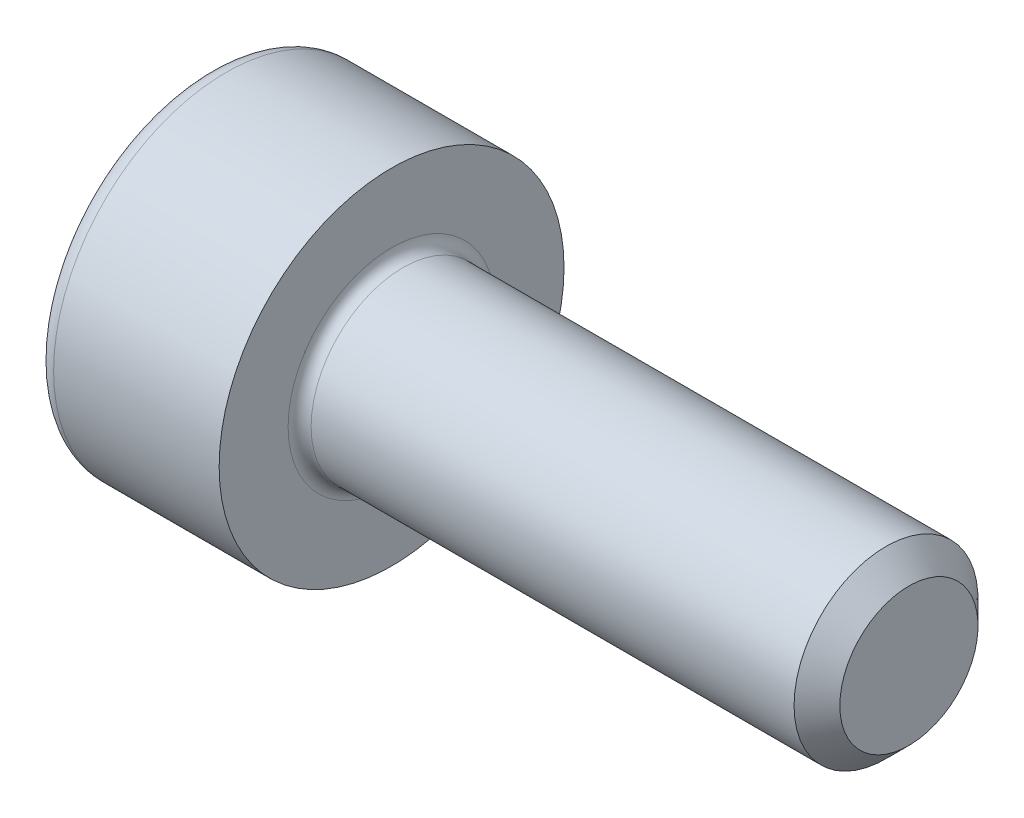
ISO-10303-21;
HEADER;
FILE_DESCRIPTION(('STEP AP214'),'2;1');
FILE_NAME('part.step','',(''),(''),'','','');
FILE_SCHEMA(('AUTOMOTIVE_DESIGN { 1 0 10303 214 1 1 1 1 }'));
ENDSEC;
DATA;
#1=APPLICATION_CONTEXT('core data for automotive mechanical design processes');
#2=APPLICATION_PROTOCOL_DEFINITION('international standard','automotive_design',2000,#1);
#3=PRODUCT_CONTEXT('',#1,'mechanical');
#4=PRODUCT('Part','Part','',(#3));
#5=PRODUCT_RELATED_PRODUCT_CATEGORY('part','',(#4));
#6=PRODUCT_DEFINITION_FORMATION('','',#4);
#7=PRODUCT_DEFINITION_CONTEXT('part definition',#1,'design');
#8=PRODUCT_DEFINITION('design','',#6,#7);
#9=PRODUCT_DEFINITION_SHAPE('','',#8);
#10=(LENGTH_UNIT() NAMED_UNIT(*) SI_UNIT(.MILLI.,.METRE.));
#11=(NAMED_UNIT(*) PLANE_ANGLE_UNIT() SI_UNIT($,.RADIAN.));
#12=(NAMED_UNIT(*) SI_UNIT($,.STERADIAN.) SOLID_ANGLE_UNIT());
#13=UNCERTAINTY_MEASURE_WITH_UNIT(LENGTH_MEASURE(1.E-05),#10,'distance_accuracy_value','');
#14=(GEOMETRIC_REPRESENTATION_CONTEXT(3) GLOBAL_UNCERTAINTY_ASSIGNED_CONTEXT((#13)) GLOBAL_UNIT_ASSIGNED_CONTEXT((#10,
#11,#12)) REPRESENTATION_CONTEXT('',''));
#15=CARTESIAN_POINT('',(0.,0.,0.));
#16=DIRECTION('',(0.,0.,1.));
#17=DIRECTION('',(1.,0.,0.));
#18=AXIS2_PLACEMENT_3D('',#15,#16,#17);
#19=CARTESIAN_POINT('',(0.,0.,0.));
#20=DIRECTION('',(-1.,0.,0.));
#21=DIRECTION('',(0.,0.,1.));
#22=AXIS2_PLACEMENT_3D('',#19,#20,#21);
#23=PLANE('',#22);
#24=DIRECTION('',(0.,-0.499999999999998,0.866025403784439));
#25=VECTOR('',#24,1.);
#26=CARTESIAN_POINT('',(0.,0.877572409168226,0.));
#27=LINE('',#26,#25);
#28=CARTESIAN_POINT('',(0.,0.877572409168226,0.));
#29=VERTEX_POINT('',#28);
#30=CARTESIAN_POINT('',(0.,0.438786204584112,0.759999999999998));
#31=VERTEX_POINT('',#30);
#32=EDGE_CURVE('E260',#29,#31,#27,.T.);
#33=ORIENTED_EDGE('',*,*,#32,.T.);
#34=DIRECTION('',(0.,1.,0.));
#35=VECTOR('',#34,1.);
#36=CARTESIAN_POINT('',(0.,-0.43878620458412,0.76));
#37=LINE('',#36,#35);
#38=CARTESIAN_POINT('',(0.,-0.43878620458412,0.76));
#39=VERTEX_POINT('',#38);
#40=EDGE_CURVE('E132',#39,#31,#37,.T.);
#41=ORIENTED_EDGE('',*,*,#40,.F.);
#42=DIRECTION('',(0.,-0.500000000000001,-0.866025403784438));
#43=VECTOR('',#42,1.);
#44=CARTESIAN_POINT('',(0.,-0.43878620458412,0.76));
#45=LINE('',#44,#43);
#46=CARTESIAN_POINT('',(0.,-0.877572409168237,0.));
#47=VERTEX_POINT('',#46);
#48=EDGE_CURVE('E263',#39,#47,#45,.T.);
#49=ORIENTED_EDGE('',*,*,#48,.T.);
#50=DIRECTION('',(0.,0.499999999999998,-0.866025403784439));
#51=VECTOR('',#50,1.);
#52=CARTESIAN_POINT('',(0.,-0.877572409168237,0.));
#53=LINE('',#52,#51);
#54=CARTESIAN_POINT('',(0.,-0.438786204584122,-0.760000000000002));
#55=VERTEX_POINT('',#54);
#56=EDGE_CURVE('E266',#47,#55,#53,.T.);
#57=ORIENTED_EDGE('',*,*,#56,.T.);
#58=DIRECTION('',(0.,-1.,0.));
#59=VECTOR('',#58,1.);
#60=CARTESIAN_POINT('',(0.,0.438786204584109,-0.760000000000003));
#61=LINE('',#60,#59);
#62=CARTESIAN_POINT('',(0.,0.438786204584109,-0.760000000000003));
#63=VERTEX_POINT('',#62);
#64=EDGE_CURVE('E269',#63,#55,#61,.T.);
#65=ORIENTED_EDGE('',*,*,#64,.F.);
#66=DIRECTION('',(0.,-0.500000000000001,-0.866025403784438));
#67=VECTOR('',#66,1.);
#68=CARTESIAN_POINT('',(0.,0.877572409168226,0.));
#69=LINE('',#68,#67);
#70=EDGE_CURVE('E127',#29,#63,#69,.T.);
#71=ORIENTED_EDGE('',*,*,#70,.F.);
#72=EDGE_LOOP('',(#33,#41,#49,#57,#65,#71));
#73=FACE_BOUND('',#72,.T.);
#74=CARTESIAN_POINT('',(0.,0.,0.));
#75=DIRECTION('',(-1.,0.,0.));
#76=DIRECTION('',(0.,0.,1.));
#77=AXIS2_PLACEMENT_3D('',#74,#75,#76);
#78=CIRCLE('',#77,1.34);
#79=CARTESIAN_POINT('',(0.,0.,1.34));
#80=VERTEX_POINT('',#79);
#81=EDGE_CURVE('E44',#80,#80,#78,.T.);
#82=ORIENTED_EDGE('',*,*,#81,.T.);
#83=EDGE_LOOP('',(#82));
#84=FACE_BOUND('',#83,.T.);
#85=ADVANCED_FACE('F36',(#73,#84),#23,.T.);
#86=CARTESIAN_POINT('',(-31.75,0.,0.));
#87=DIRECTION('',(-1.,0.,0.));
#88=DIRECTION('',(0.,0.,1.));
#89=AXIS2_PLACEMENT_3D('',#86,#87,#88);
#90=CYLINDRICAL_SURFACE('',#89,1.5);
#91=CARTESIAN_POINT('',(0.16,0.,0.));
#92=DIRECTION('',(-1.,0.,0.));
#93=DIRECTION('',(0.,0.,1.));
#94=AXIS2_PLACEMENT_3D('',#91,#92,#93);
#95=CIRCLE('',#94,1.5);
#96=CARTESIAN_POINT('',(0.16,0.,1.5));
#97=VERTEX_POINT('',#96);
#98=EDGE_CURVE('E11',#97,#97,#95,.F.);
#99=ORIENTED_EDGE('',*,*,#98,.T.);
#100=EDGE_LOOP('',(#99));
#101=FACE_BOUND('',#100,.T.);
#102=CARTESIAN_POINT('',(1.6,0.,0.));
#103=DIRECTION('',(-1.,0.,0.));
#104=DIRECTION('',(0.,0.,1.));
#105=AXIS2_PLACEMENT_3D('',#102,#103,#104);
#106=CIRCLE('',#105,1.5);
#107=CARTESIAN_POINT('',(1.6,0.,1.5));
#108=VERTEX_POINT('',#107);
#109=EDGE_CURVE('E150',#108,#108,#106,.T.);
#110=ORIENTED_EDGE('',*,*,#109,.T.);
#111=EDGE_LOOP('',(#110));
#112=FACE_BOUND('',#111,.T.);
#113=ADVANCED_FACE('F174',(#101,#112),#90,.T.);
#114=CARTESIAN_POINT('',(1.6,1.5,0.));
#115=DIRECTION('',(1.,0.,0.));
#116=DIRECTION('',(0.,0.,-1.));
#117=AXIS2_PLACEMENT_3D('',#114,#115,#116);
#118=PLANE('',#117);
#119=CARTESIAN_POINT('',(1.6,0.,0.));
#120=DIRECTION('',(1.,0.,0.));
#121=DIRECTION('',(0.,0.,-1.));
#122=AXIS2_PLACEMENT_3D('',#119,#120,#121);
#123=CIRCLE('',#122,0.899999999999994);
#124=CARTESIAN_POINT('',(1.6,0.,-0.899999999999994));
#125=VERTEX_POINT('',#124);
#126=EDGE_CURVE('E153',#125,#125,#123,.F.);
#127=ORIENTED_EDGE('',*,*,#126,.T.);
#128=EDGE_LOOP('',(#127));
#129=FACE_BOUND('',#128,.T.);
#130=ORIENTED_EDGE('',*,*,#109,.F.);
#131=EDGE_LOOP('',(#130));
#132=FACE_BOUND('',#131,.T.);
#133=ADVANCED_FACE('F180',(#129,#132),#118,.T.);
#134=CARTESIAN_POINT('',(-31.75,0.,0.));
#135=DIRECTION('',(-1.,0.,0.));
#136=DIRECTION('',(0.,0.,1.));
#137=AXIS2_PLACEMENT_3D('',#134,#135,#136);
#138=CYLINDRICAL_SURFACE('',#137,0.799999999999994);
#139=CARTESIAN_POINT('',(1.7,0.,0.));
#140=DIRECTION('',(1.,0.,0.));
#141=DIRECTION('',(0.,0.,-1.));
#142=AXIS2_PLACEMENT_3D('',#139,#140,#141);
#143=CIRCLE('',#142,0.799999999999994);
#144=CARTESIAN_POINT('',(1.7,0.,-0.799999999999994));
#145=VERTEX_POINT('',#144);
#146=EDGE_CURVE('E156',#145,#145,#143,.T.);
#147=ORIENTED_EDGE('',*,*,#146,.T.);
#148=EDGE_LOOP('',(#147));
#149=FACE_BOUND('',#148,.T.);
#150=CARTESIAN_POINT('',(5.90099999999999,0.,0.));
#151=DIRECTION('',(-1.,0.,0.));
#152=DIRECTION('',(0.,0.,1.));
#153=AXIS2_PLACEMENT_3D('',#150,#151,#152);
#154=CIRCLE('',#153,0.799999999999989);
#155=CARTESIAN_POINT('',(5.90099999999999,0.,0.799999999999989));
#156=VERTEX_POINT('',#155);
#157=EDGE_CURVE('E147',#156,#156,#154,.T.);
#158=ORIENTED_EDGE('',*,*,#157,.T.);
#159=EDGE_LOOP('',(#158));
#160=FACE_BOUND('',#159,.T.);
#161=ADVANCED_FACE('F186',(#149,#160),#138,.T.);
#162=CARTESIAN_POINT('',(6.1,0.,0.));
#163=DIRECTION('',(-1.,0.,0.));
#164=DIRECTION('',(0.,0.,1.));
#165=AXIS2_PLACEMENT_3D('',#162,#163,#164);
#166=CONICAL_SURFACE('',#165,0.601,0.785398163397391);
#167=ORIENTED_EDGE('',*,*,#157,.F.);
#168=EDGE_LOOP('',(#167));
#169=FACE_BOUND('',#168,.T.);
#170=CARTESIAN_POINT('',(6.1,0.,0.));
#171=DIRECTION('',(-1.,0.,0.));
#172=DIRECTION('',(0.,0.,1.));
#173=AXIS2_PLACEMENT_3D('',#170,#171,#172);
#174=CIRCLE('',#173,0.601);
#175=CARTESIAN_POINT('',(6.1,0.,0.601));
#176=VERTEX_POINT('',#175);
#177=EDGE_CURVE('E143',#176,#176,#174,.T.);
#178=ORIENTED_EDGE('',*,*,#177,.T.);
#179=EDGE_LOOP('',(#178));
#180=FACE_BOUND('',#179,.T.);
#181=ADVANCED_FACE('F190',(#169,#180),#166,.T.);
#182=CARTESIAN_POINT('',(6.1,0.601,0.));
#183=DIRECTION('',(1.,0.,0.));
#184=DIRECTION('',(0.,0.,-1.));
#185=AXIS2_PLACEMENT_3D('',#182,#183,#184);
#186=PLANE('',#185);
#187=ORIENTED_EDGE('',*,*,#177,.F.);
#188=EDGE_LOOP('',(#187));
#189=FACE_BOUND('',#188,.T.);
#190=ADVANCED_FACE('F170',(#189),#186,.T.);
#191=CARTESIAN_POINT('',(1.7,0.,0.));
#192=DIRECTION('',(1.,0.,0.));
#193=DIRECTION('',(0.,0.,-1.));
#194=AXIS2_PLACEMENT_3D('',#191,#192,#193);
#195=TOROIDAL_SURFACE('',#194,0.899999999999994,0.1);
#196=ORIENTED_EDGE('',*,*,#146,.F.);
#197=EDGE_LOOP('',(#196));
#198=FACE_BOUND('',#197,.T.);
#199=ORIENTED_EDGE('',*,*,#126,.F.);
#200=EDGE_LOOP('',(#199));
#201=FACE_BOUND('',#200,.T.);
#202=ADVANCED_FACE('F163',(#198,#201),#195,.F.);
#203=CARTESIAN_POINT('',(0.16,0.,0.));
#204=DIRECTION('',(-1.,0.,0.));
#205=DIRECTION('',(0.,0.,1.));
#206=AXIS2_PLACEMENT_3D('',#203,#204,#205);
#207=TOROIDAL_SURFACE('',#206,1.34,0.16);
#208=ORIENTED_EDGE('',*,*,#98,.F.);
#209=EDGE_LOOP('',(#208));
#210=FACE_BOUND('',#209,.T.);
#211=ORIENTED_EDGE('',*,*,#81,.F.);
#212=EDGE_LOOP('',(#211));
#213=FACE_BOUND('',#212,.T.);
#214=ADVANCED_FACE('F38',(#210,#213),#207,.T.);
#215=CARTESIAN_POINT('',(0.7,0.877572409168226,0.));
#216=DIRECTION('',(0.,-0.86602540378444,-0.499999999999998));
#217=DIRECTION('',(0.,0.499999999999998,-0.86602540378444));
#218=AXIS2_PLACEMENT_3D('',#215,#216,#217);
#219=PLANE('',#218);
#220=ORIENTED_EDGE('',*,*,#32,.F.);
#221=DIRECTION('',(-1.,0.,0.));
#222=VECTOR('',#221,1.);
#223=CARTESIAN_POINT('',(0.7,0.877572409168226,0.));
#224=LINE('',#223,#222);
#225=CARTESIAN_POINT('',(0.7,0.877572409168226,0.));
#226=VERTEX_POINT('',#225);
#227=EDGE_CURVE('E250',#226,#29,#224,.T.);
#228=ORIENTED_EDGE('',*,*,#227,.F.);
#229=DIRECTION('',(0.,-0.499999999999998,0.866025403784439));
#230=VECTOR('',#229,1.);
#231=CARTESIAN_POINT('',(0.7,0.877572409168226,0.));
#232=LINE('',#231,#230);
#233=CARTESIAN_POINT('',(0.7,0.65817930687617,0.379999999999996));
#234=VERTEX_POINT('',#233);
#235=EDGE_CURVE('E119',#226,#234,#232,.T.);
#236=ORIENTED_EDGE('',*,*,#235,.T.);
#237=CARTESIAN_POINT('',(0.7,0.438786204584112,0.759999999999998));
#238=VERTEX_POINT('',#237);
#239=EDGE_CURVE('E110',#234,#238,#232,.T.);
#240=ORIENTED_EDGE('',*,*,#239,.T.);
#241=DIRECTION('',(-1.,0.,0.));
#242=VECTOR('',#241,1.);
#243=CARTESIAN_POINT('',(0.7,0.438786204584112,0.759999999999998));
#244=LINE('',#243,#242);
#245=EDGE_CURVE('E124',#238,#31,#244,.T.);
#246=ORIENTED_EDGE('',*,*,#245,.T.);
#247=EDGE_LOOP('',(#220,#228,#236,#240,#246));
#248=FACE_BOUND('',#247,.T.);
#249=ADVANCED_FACE('F123',(#248),#219,.T.);
#250=CARTESIAN_POINT('',(0.7,-0.43878620458412,0.76));
#251=DIRECTION('',(0.,0.,1.));
#252=DIRECTION('',(0.,-1.,0.));
#253=AXIS2_PLACEMENT_3D('',#250,#251,#252);
#254=PLANE('',#253);
#255=ORIENTED_EDGE('',*,*,#40,.T.);
#256=ORIENTED_EDGE('',*,*,#245,.F.);
#257=DIRECTION('',(0.,1.,0.));
#258=VECTOR('',#257,1.);
#259=CARTESIAN_POINT('',(0.7,-0.43878620458412,0.76));
#260=LINE('',#259,#258);
#261=CARTESIAN_POINT('',(0.7,0.,0.759999999999999));
#262=VERTEX_POINT('',#261);
#263=EDGE_CURVE('E107',#262,#238,#260,.T.);
#264=ORIENTED_EDGE('',*,*,#263,.F.);
#265=CARTESIAN_POINT('',(0.7,-0.43878620458412,0.76));
#266=VERTEX_POINT('',#265);
#267=EDGE_CURVE('E118',#266,#262,#260,.T.);
#268=ORIENTED_EDGE('',*,*,#267,.F.);
#269=DIRECTION('',(-1.,0.,0.));
#270=VECTOR('',#269,1.);
#271=CARTESIAN_POINT('',(0.7,-0.43878620458412,0.76));
#272=LINE('',#271,#270);
#273=EDGE_CURVE('E134',#266,#39,#272,.T.);
#274=ORIENTED_EDGE('',*,*,#273,.T.);
#275=EDGE_LOOP('',(#255,#256,#264,#268,#274));
#276=FACE_BOUND('',#275,.T.);
#277=ADVANCED_FACE('F129',(#276),#254,.F.);
#278=CARTESIAN_POINT('',(0.7,-0.43878620458412,0.76));
#279=DIRECTION('',(0.,0.866025403784438,-0.500000000000001));
#280=DIRECTION('',(0.,0.500000000000001,0.866025403784438));
#281=AXIS2_PLACEMENT_3D('',#278,#279,#280);
#282=PLANE('',#281);
#283=ORIENTED_EDGE('',*,*,#48,.F.);
#284=ORIENTED_EDGE('',*,*,#273,.F.);
#285=DIRECTION('',(0.,-0.500000000000001,-0.866025403784438));
#286=VECTOR('',#285,1.);
#287=CARTESIAN_POINT('',(0.7,-0.43878620458412,0.76));
#288=LINE('',#287,#286);
#289=CARTESIAN_POINT('',(0.7,-0.658179306876177,0.380000000000003));
#290=VERTEX_POINT('',#289);
#291=EDGE_CURVE('E289',#266,#290,#288,.T.);
#292=ORIENTED_EDGE('',*,*,#291,.T.);
#293=CARTESIAN_POINT('',(0.7,-0.877572409168237,0.));
#294=VERTEX_POINT('',#293);
#295=EDGE_CURVE('E278',#290,#294,#288,.T.);
#296=ORIENTED_EDGE('',*,*,#295,.T.);
#297=DIRECTION('',(-1.,0.,0.));
#298=VECTOR('',#297,1.);
#299=CARTESIAN_POINT('',(0.7,-0.877572409168237,0.));
#300=LINE('',#299,#298);
#301=EDGE_CURVE('E139',#294,#47,#300,.T.);
#302=ORIENTED_EDGE('',*,*,#301,.T.);
#303=EDGE_LOOP('',(#283,#284,#292,#296,#302));
#304=FACE_BOUND('',#303,.T.);
#305=ADVANCED_FACE('F204',(#304),#282,.T.);
#306=CARTESIAN_POINT('',(0.7,-0.877572409168237,0.));
#307=DIRECTION('',(0.,0.86602540378444,0.499999999999998));
#308=DIRECTION('',(0.,-0.499999999999998,0.86602540378444));
#309=AXIS2_PLACEMENT_3D('',#306,#307,#308);
#310=PLANE('',#309);
#311=ORIENTED_EDGE('',*,*,#56,.F.);
#312=ORIENTED_EDGE('',*,*,#301,.F.);
#313=DIRECTION('',(0.,0.499999999999998,-0.866025403784439));
#314=VECTOR('',#313,1.);
#315=CARTESIAN_POINT('',(0.7,-0.877572409168237,0.));
#316=LINE('',#315,#314);
#317=CARTESIAN_POINT('',(0.7,-0.658179306876179,-0.380000000000002));
#318=VERTEX_POINT('',#317);
#319=EDGE_CURVE('E256',#294,#318,#316,.T.);
#320=ORIENTED_EDGE('',*,*,#319,.T.);
#321=CARTESIAN_POINT('',(0.7,-0.438786204584122,-0.760000000000002));
#322=VERTEX_POINT('',#321);
#323=EDGE_CURVE('E288',#318,#322,#316,.T.);
#324=ORIENTED_EDGE('',*,*,#323,.T.);
#325=DIRECTION('',(-1.,0.,0.));
#326=VECTOR('',#325,1.);
#327=CARTESIAN_POINT('',(0.7,-0.438786204584122,-0.760000000000002));
#328=LINE('',#327,#326);
#329=EDGE_CURVE('E249',#322,#55,#328,.T.);
#330=ORIENTED_EDGE('',*,*,#329,.T.);
#331=EDGE_LOOP('',(#311,#312,#320,#324,#330));
#332=FACE_BOUND('',#331,.T.);
#333=ADVANCED_FACE('F207',(#332),#310,.T.);
#334=CARTESIAN_POINT('',(0.7,0.438786204584109,-0.760000000000003));
#335=DIRECTION('',(0.,0.,-1.));
#336=DIRECTION('',(0.,1.,0.));
#337=AXIS2_PLACEMENT_3D('',#334,#335,#336);
#338=PLANE('',#337);
#339=ORIENTED_EDGE('',*,*,#64,.T.);
#340=ORIENTED_EDGE('',*,*,#329,.F.);
#341=DIRECTION('',(0.,-1.,0.));
#342=VECTOR('',#341,1.);
#343=CARTESIAN_POINT('',(0.7,0.438786204584109,-0.760000000000003));
#344=LINE('',#343,#342);
#345=CARTESIAN_POINT('',(0.7,0.,-0.76));
#346=VERTEX_POINT('',#345);
#347=EDGE_CURVE('E253',#346,#322,#344,.T.);
#348=ORIENTED_EDGE('',*,*,#347,.F.);
#349=CARTESIAN_POINT('',(0.7,0.438786204584109,-0.760000000000003));
#350=VERTEX_POINT('',#349);
#351=EDGE_CURVE('E51',#350,#346,#344,.T.);
#352=ORIENTED_EDGE('',*,*,#351,.F.);
#353=DIRECTION('',(-1.,0.,0.));
#354=VECTOR('',#353,1.);
#355=CARTESIAN_POINT('',(0.7,0.438786204584109,-0.760000000000003));
#356=LINE('',#355,#354);
#357=EDGE_CURVE('E246',#350,#63,#356,.T.);
#358=ORIENTED_EDGE('',*,*,#357,.T.);
#359=EDGE_LOOP('',(#339,#340,#348,#352,#358));
#360=FACE_BOUND('',#359,.T.);
#361=ADVANCED_FACE('F211',(#360),#338,.F.);
#362=CARTESIAN_POINT('',(0.7,0.877572409168226,0.));
#363=DIRECTION('',(0.,0.866025403784438,-0.500000000000001));
#364=DIRECTION('',(0.,0.500000000000001,0.866025403784438));
#365=AXIS2_PLACEMENT_3D('',#362,#363,#364);
#366=PLANE('',#365);
#367=ORIENTED_EDGE('',*,*,#70,.T.);
#368=ORIENTED_EDGE('',*,*,#357,.F.);
#369=DIRECTION('',(0.,-0.500000000000001,-0.866025403784438));
#370=VECTOR('',#369,1.);
#371=CARTESIAN_POINT('',(0.7,0.877572409168226,0.));
#372=LINE('',#371,#370);
#373=CARTESIAN_POINT('',(0.7,0.65817930687617,-0.379999999999999));
#374=VERTEX_POINT('',#373);
#375=EDGE_CURVE('E236',#374,#350,#372,.T.);
#376=ORIENTED_EDGE('',*,*,#375,.F.);
#377=EDGE_CURVE('E242',#226,#374,#372,.T.);
#378=ORIENTED_EDGE('',*,*,#377,.F.);
#379=ORIENTED_EDGE('',*,*,#227,.T.);
#380=EDGE_LOOP('',(#367,#368,#376,#378,#379));
#381=FACE_BOUND('',#380,.T.);
#382=ADVANCED_FACE('F215',(#381),#366,.F.);
#383=CARTESIAN_POINT('',(0.7,1.31635861375234,-0.760000000000004));
#384=DIRECTION('',(1.,0.,0.));
#385=DIRECTION('',(0.,0.,-1.));
#386=AXIS2_PLACEMENT_3D('',#383,#384,#385);
#387=PLANE('',#386);
#388=ORIENTED_EDGE('',*,*,#347,.T.);
#389=ORIENTED_EDGE('',*,*,#323,.F.);
#390=CARTESIAN_POINT('',(0.7,0.,0.));
#391=DIRECTION('',(-1.,0.,0.));
#392=DIRECTION('',(0.,0.,1.));
#393=AXIS2_PLACEMENT_3D('',#390,#391,#392);
#394=CIRCLE('',#393,0.76);
#395=EDGE_CURVE('E284',#346,#318,#394,.T.);
#396=ORIENTED_EDGE('',*,*,#395,.F.);
#397=EDGE_LOOP('',(#388,#389,#396));
#398=FACE_BOUND('',#397,.T.);
#399=ADVANCED_FACE('F219',(#398),#387,.F.);
#400=ORIENTED_EDGE('',*,*,#319,.F.);
#401=ORIENTED_EDGE('',*,*,#295,.F.);
#402=EDGE_CURVE('E137',#318,#290,#394,.T.);
#403=ORIENTED_EDGE('',*,*,#402,.F.);
#404=EDGE_LOOP('',(#400,#401,#403));
#405=FACE_BOUND('',#404,.T.);
#406=ADVANCED_FACE('F222',(#405),#387,.F.);
#407=ORIENTED_EDGE('',*,*,#291,.F.);
#408=ORIENTED_EDGE('',*,*,#267,.T.);
#409=EDGE_CURVE('E133',#290,#262,#394,.T.);
#410=ORIENTED_EDGE('',*,*,#409,.F.);
#411=EDGE_LOOP('',(#407,#408,#410));
#412=FACE_BOUND('',#411,.T.);
#413=ADVANCED_FACE('F227',(#412),#387,.F.);
#414=ORIENTED_EDGE('',*,*,#263,.T.);
#415=ORIENTED_EDGE('',*,*,#239,.F.);
#416=EDGE_CURVE('E113',#262,#234,#394,.T.);
#417=ORIENTED_EDGE('',*,*,#416,.F.);
#418=EDGE_LOOP('',(#414,#415,#417));
#419=FACE_BOUND('',#418,.T.);
#420=ADVANCED_FACE('F109',(#419),#387,.F.);
#421=ORIENTED_EDGE('',*,*,#235,.F.);
#422=ORIENTED_EDGE('',*,*,#377,.T.);
#423=EDGE_CURVE('E144',#234,#374,#394,.T.);
#424=ORIENTED_EDGE('',*,*,#423,.F.);
#425=EDGE_LOOP('',(#421,#422,#424));
#426=FACE_BOUND('',#425,.T.);
#427=ADVANCED_FACE('F230',(#426),#387,.F.);
#428=ORIENTED_EDGE('',*,*,#375,.T.);
#429=ORIENTED_EDGE('',*,*,#351,.T.);
#430=EDGE_CURVE('E239',#374,#346,#394,.T.);
#431=ORIENTED_EDGE('',*,*,#430,.F.);
#432=EDGE_LOOP('',(#428,#429,#431));
#433=FACE_BOUND('',#432,.T.);
#434=ADVANCED_FACE('F200',(#433),#387,.F.);
#435=CARTESIAN_POINT('',(0.7,0.,0.));
#436=DIRECTION('',(-1.,0.,0.));
#437=DIRECTION('',(0.,0.,1.));
#438=AXIS2_PLACEMENT_3D('',#435,#436,#437);
#439=CONICAL_SURFACE('',#438,0.76,1.0471975511966);
#440=CARTESIAN_POINT('',(1.13878620458412,0.,0.));
#441=VERTEX_POINT('',#440);
#442=VERTEX_LOOP('',#441);
#443=FACE_BOUND('',#442,.T.);
#444=ORIENTED_EDGE('',*,*,#416,.T.);
#445=ORIENTED_EDGE('',*,*,#423,.T.);
#446=ORIENTED_EDGE('',*,*,#430,.T.);
#447=ORIENTED_EDGE('',*,*,#395,.T.);
#448=ORIENTED_EDGE('',*,*,#402,.T.);
#449=ORIENTED_EDGE('',*,*,#409,.T.);
#450=EDGE_LOOP('',(#444,#445,#446,#447,#448,#449));
#451=FACE_BOUND('',#450,.T.);
#452=ADVANCED_FACE('F198',(#443,#451),#439,.F.);
#453=CLOSED_SHELL('',(#85,#113,#133,#161,#181,#190,#202,#214,#249,#277,#305,#333,#361,#382,#399,
#406,#413,#420,#427,#434,#452));
#454=MANIFOLD_SOLID_BREP('B2',#453);
#455=ADVANCED_BREP_SHAPE_REPRESENTATION('',(#18,#454),#14);
#456=SHAPE_DEFINITION_REPRESENTATION(#9,#455);
ENDSEC;
END-ISO-10303-21;
